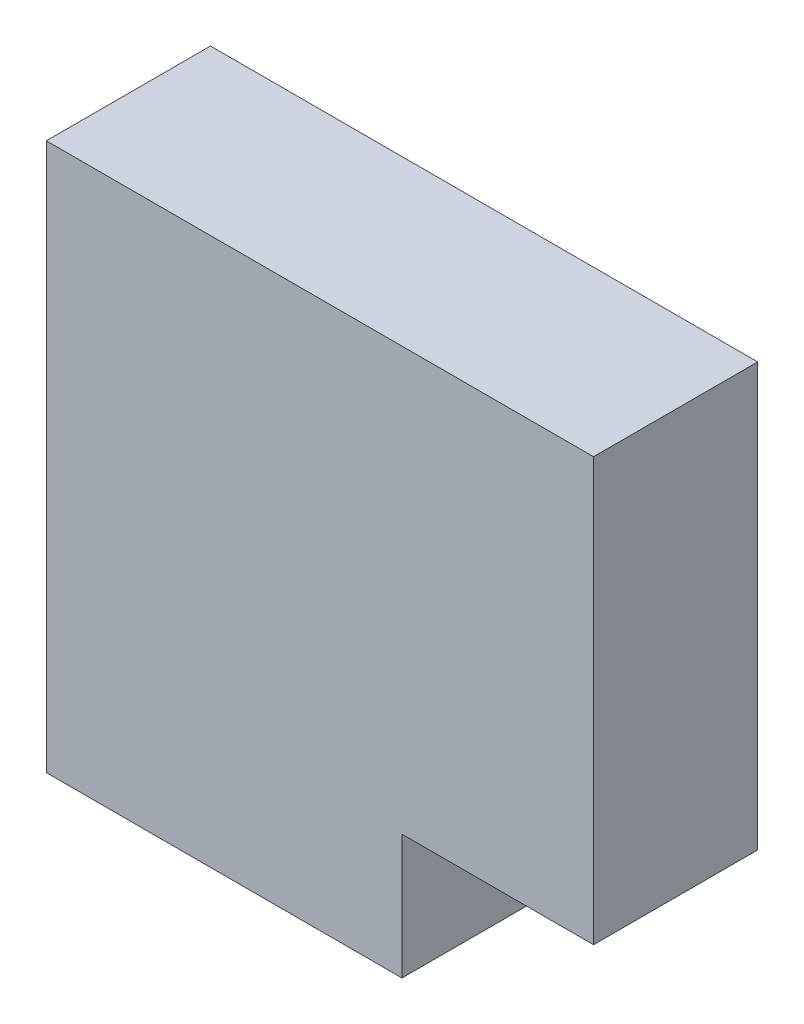
ISO-10303-21;
HEADER;
FILE_DESCRIPTION(('STEP AP214'),'2;1');
FILE_NAME('part.step','',(''),(''),'','','');
FILE_SCHEMA(('AUTOMOTIVE_DESIGN { 1 0 10303 214 1 1 1 1 }'));
ENDSEC;
DATA;
#1=APPLICATION_CONTEXT('core data for automotive mechanical design processes');
#2=APPLICATION_PROTOCOL_DEFINITION('international standard','automotive_design',2000,#1);
#3=PRODUCT_CONTEXT('',#1,'mechanical');
#4=PRODUCT('Part','Part','',(#3));
#5=PRODUCT_RELATED_PRODUCT_CATEGORY('part','',(#4));
#6=PRODUCT_DEFINITION_FORMATION('','',#4);
#7=PRODUCT_DEFINITION_CONTEXT('part definition',#1,'design');
#8=PRODUCT_DEFINITION('design','',#6,#7);
#9=PRODUCT_DEFINITION_SHAPE('','',#8);
#10=(LENGTH_UNIT() NAMED_UNIT(*) SI_UNIT(.MILLI.,.METRE.));
#11=(NAMED_UNIT(*) PLANE_ANGLE_UNIT() SI_UNIT($,.RADIAN.));
#12=(NAMED_UNIT(*) SI_UNIT($,.STERADIAN.) SOLID_ANGLE_UNIT());
#13=UNCERTAINTY_MEASURE_WITH_UNIT(LENGTH_MEASURE(1.E-05),#10,'distance_accuracy_value','');
#14=(GEOMETRIC_REPRESENTATION_CONTEXT(3) GLOBAL_UNCERTAINTY_ASSIGNED_CONTEXT((#13)) GLOBAL_UNIT_ASSIGNED_CONTEXT((#10,
#11,#12)) REPRESENTATION_CONTEXT('',''));
#15=CARTESIAN_POINT('',(0.,0.,0.));
#16=DIRECTION('',(0.,0.,1.));
#17=DIRECTION('',(1.,0.,0.));
#18=AXIS2_PLACEMENT_3D('',#15,#16,#17);
#19=CARTESIAN_POINT('',(-7.76124141762908,11.057268722467,6.));
#20=DIRECTION('',(1.,0.,0.));
#21=DIRECTION('',(0.,1.,0.));
#22=AXIS2_PLACEMENT_3D('',#19,#20,#21);
#23=PLANE('',#22);
#24=DIRECTION('',(0.,-1.,0.));
#25=VECTOR('',#24,1.);
#26=CARTESIAN_POINT('',(-7.76124141762908,11.057268722467,0.));
#27=LINE('',#26,#25);
#28=CARTESIAN_POINT('',(-7.76124141762908,11.057268722467,0.));
#29=VERTEX_POINT('',#28);
#30=CARTESIAN_POINT('',(-7.76124141762908,-8.94273127753303,0.));
#31=VERTEX_POINT('',#30);
#32=EDGE_CURVE('E112',#29,#31,#27,.T.);
#33=ORIENTED_EDGE('',*,*,#32,.T.);
#34=DIRECTION('',(0.,0.,-1.));
#35=VECTOR('',#34,1.);
#36=CARTESIAN_POINT('',(-7.76124141762908,-8.94273127753303,6.));
#37=LINE('',#36,#35);
#38=CARTESIAN_POINT('',(-7.76124141762908,-8.94273127753303,6.));
#39=VERTEX_POINT('',#38);
#40=EDGE_CURVE('E11',#39,#31,#37,.T.);
#41=ORIENTED_EDGE('',*,*,#40,.F.);
#42=DIRECTION('',(0.,-1.,0.));
#43=VECTOR('',#42,1.);
#44=CARTESIAN_POINT('',(-7.76124141762908,11.057268722467,6.));
#45=LINE('',#44,#43);
#46=CARTESIAN_POINT('',(-7.76124141762908,11.057268722467,6.));
#47=VERTEX_POINT('',#46);
#48=EDGE_CURVE('E120',#47,#39,#45,.T.);
#49=ORIENTED_EDGE('',*,*,#48,.F.);
#50=DIRECTION('',(0.,0.,-1.));
#51=VECTOR('',#50,1.);
#52=CARTESIAN_POINT('',(-7.76124141762908,11.057268722467,6.));
#53=LINE('',#52,#51);
#54=EDGE_CURVE('E121',#47,#29,#53,.T.);
#55=ORIENTED_EDGE('',*,*,#54,.T.);
#56=EDGE_LOOP('',(#33,#41,#49,#55));
#57=FACE_BOUND('',#56,.T.);
#58=ADVANCED_FACE('F33',(#57),#23,.F.);
#59=CARTESIAN_POINT('',(-7.76124141762908,-8.94273127753303,6.));
#60=DIRECTION('',(0.,1.,0.));
#61=DIRECTION('',(0.,0.,1.));
#62=AXIS2_PLACEMENT_3D('',#59,#60,#61);
#63=PLANE('',#62);
#64=DIRECTION('',(1.,0.,0.));
#65=VECTOR('',#64,1.);
#66=CARTESIAN_POINT('',(-7.76124141762908,-8.94273127753303,0.));
#67=LINE('',#66,#65);
#68=CARTESIAN_POINT('',(5.23875858237092,-8.94273127753303,0.));
#69=VERTEX_POINT('',#68);
#70=EDGE_CURVE('E104',#31,#69,#67,.T.);
#71=ORIENTED_EDGE('',*,*,#70,.T.);
#72=DIRECTION('',(0.,0.,1.));
#73=VECTOR('',#72,1.);
#74=CARTESIAN_POINT('',(5.23875858237092,-8.94273127753303,0.));
#75=LINE('',#74,#73);
#76=CARTESIAN_POINT('',(5.23875858237092,-8.94273127753303,6.));
#77=VERTEX_POINT('',#76);
#78=EDGE_CURVE('E92',#69,#77,#75,.T.);
#79=ORIENTED_EDGE('',*,*,#78,.T.);
#80=DIRECTION('',(1.,0.,0.));
#81=VECTOR('',#80,1.);
#82=CARTESIAN_POINT('',(-7.76124141762908,-8.94273127753303,6.));
#83=LINE('',#82,#81);
#84=EDGE_CURVE('E79',#39,#77,#83,.T.);
#85=ORIENTED_EDGE('',*,*,#84,.F.);
#86=ORIENTED_EDGE('',*,*,#40,.T.);
#87=EDGE_LOOP('',(#71,#79,#85,#86));
#88=FACE_BOUND('',#87,.T.);
#89=ADVANCED_FACE('F108',(#88),#63,.F.);
#90=CARTESIAN_POINT('',(12.2387585823709,11.057268722467,6.));
#91=DIRECTION('',(-1.,0.,0.));
#92=DIRECTION('',(0.,-1.,0.));
#93=AXIS2_PLACEMENT_3D('',#90,#91,#92);
#94=PLANE('',#93);
#95=DIRECTION('',(0.,1.,0.));
#96=VECTOR('',#95,1.);
#97=CARTESIAN_POINT('',(12.2387585823709,11.057268722467,6.));
#98=LINE('',#97,#96);
#99=CARTESIAN_POINT('',(12.2387585823709,-4.39046706234745,6.));
#100=VERTEX_POINT('',#99);
#101=CARTESIAN_POINT('',(12.2387585823709,11.057268722467,6.));
#102=VERTEX_POINT('',#101);
#103=EDGE_CURVE('E129',#100,#102,#98,.T.);
#104=ORIENTED_EDGE('',*,*,#103,.F.);
#105=DIRECTION('',(0.,0.,1.));
#106=VECTOR('',#105,1.);
#107=CARTESIAN_POINT('',(12.2387585823709,-4.39046706234745,0.));
#108=LINE('',#107,#106);
#109=CARTESIAN_POINT('',(12.2387585823709,-4.39046706234745,0.));
#110=VERTEX_POINT('',#109);
#111=EDGE_CURVE('E97',#110,#100,#108,.T.);
#112=ORIENTED_EDGE('',*,*,#111,.F.);
#113=DIRECTION('',(0.,1.,0.));
#114=VECTOR('',#113,1.);
#115=CARTESIAN_POINT('',(12.2387585823709,11.057268722467,0.));
#116=LINE('',#115,#114);
#117=CARTESIAN_POINT('',(12.2387585823709,11.057268722467,0.));
#118=VERTEX_POINT('',#117);
#119=EDGE_CURVE('E111',#110,#118,#116,.T.);
#120=ORIENTED_EDGE('',*,*,#119,.T.);
#121=DIRECTION('',(0.,0.,-1.));
#122=VECTOR('',#121,1.);
#123=CARTESIAN_POINT('',(12.2387585823709,11.057268722467,6.));
#124=LINE('',#123,#122);
#125=EDGE_CURVE('E40',#102,#118,#124,.T.);
#126=ORIENTED_EDGE('',*,*,#125,.F.);
#127=EDGE_LOOP('',(#104,#112,#120,#126));
#128=FACE_BOUND('',#127,.T.);
#129=ADVANCED_FACE('F137',(#128),#94,.F.);
#130=CARTESIAN_POINT('',(-7.76124141762908,11.057268722467,6.));
#131=DIRECTION('',(0.,-1.,0.));
#132=DIRECTION('',(0.,0.,-1.));
#133=AXIS2_PLACEMENT_3D('',#130,#131,#132);
#134=PLANE('',#133);
#135=DIRECTION('',(-1.,0.,0.));
#136=VECTOR('',#135,1.);
#137=CARTESIAN_POINT('',(-7.76124141762908,11.057268722467,0.));
#138=LINE('',#137,#136);
#139=EDGE_CURVE('E73',#118,#29,#138,.T.);
#140=ORIENTED_EDGE('',*,*,#139,.T.);
#141=ORIENTED_EDGE('',*,*,#54,.F.);
#142=DIRECTION('',(-1.,0.,0.));
#143=VECTOR('',#142,1.);
#144=CARTESIAN_POINT('',(-7.76124141762908,11.057268722467,6.));
#145=LINE('',#144,#143);
#146=EDGE_CURVE('E56',#102,#47,#145,.T.);
#147=ORIENTED_EDGE('',*,*,#146,.F.);
#148=ORIENTED_EDGE('',*,*,#125,.T.);
#149=EDGE_LOOP('',(#140,#141,#147,#148));
#150=FACE_BOUND('',#149,.T.);
#151=ADVANCED_FACE('F123',(#150),#134,.F.);
#152=CARTESIAN_POINT('',(0.,0.,6.));
#153=DIRECTION('',(0.,0.,1.));
#154=DIRECTION('',(1.,0.,0.));
#155=AXIS2_PLACEMENT_3D('',#152,#153,#154);
#156=PLANE('',#155);
#157=DIRECTION('',(0.,-1.,0.));
#158=VECTOR('',#157,1.);
#159=CARTESIAN_POINT('',(5.23875858237092,-4.39046706234745,6.));
#160=LINE('',#159,#158);
#161=CARTESIAN_POINT('',(5.23875858237092,-4.39046706234745,6.));
#162=VERTEX_POINT('',#161);
#163=EDGE_CURVE('E95',#162,#77,#160,.T.);
#164=ORIENTED_EDGE('',*,*,#163,.F.);
#165=DIRECTION('',(-1.,0.,0.));
#166=VECTOR('',#165,1.);
#167=CARTESIAN_POINT('',(5.23875858237092,-4.39046706234745,6.));
#168=LINE('',#167,#166);
#169=EDGE_CURVE('E106',#100,#162,#168,.T.);
#170=ORIENTED_EDGE('',*,*,#169,.F.);
#171=ORIENTED_EDGE('',*,*,#103,.T.);
#172=ORIENTED_EDGE('',*,*,#146,.T.);
#173=ORIENTED_EDGE('',*,*,#48,.T.);
#174=ORIENTED_EDGE('',*,*,#84,.T.);
#175=EDGE_LOOP('',(#164,#170,#171,#172,#173,#174));
#176=FACE_BOUND('',#175,.T.);
#177=ADVANCED_FACE('F134',(#176),#156,.T.);
#178=CARTESIAN_POINT('',(0.,0.,0.));
#179=DIRECTION('',(0.,0.,1.));
#180=DIRECTION('',(1.,0.,0.));
#181=AXIS2_PLACEMENT_3D('',#178,#179,#180);
#182=PLANE('',#181);
#183=DIRECTION('',(-1.,0.,0.));
#184=VECTOR('',#183,1.);
#185=CARTESIAN_POINT('',(5.23875858237092,-4.39046706234745,0.));
#186=LINE('',#185,#184);
#187=CARTESIAN_POINT('',(5.23875858237092,-4.39046706234745,0.));
#188=VERTEX_POINT('',#187);
#189=EDGE_CURVE('E98',#110,#188,#186,.T.);
#190=ORIENTED_EDGE('',*,*,#189,.T.);
#191=DIRECTION('',(0.,-1.,0.));
#192=VECTOR('',#191,1.);
#193=CARTESIAN_POINT('',(5.23875858237092,-4.39046706234745,0.));
#194=LINE('',#193,#192);
#195=EDGE_CURVE('E47',#188,#69,#194,.T.);
#196=ORIENTED_EDGE('',*,*,#195,.T.);
#197=ORIENTED_EDGE('',*,*,#70,.F.);
#198=ORIENTED_EDGE('',*,*,#32,.F.);
#199=ORIENTED_EDGE('',*,*,#139,.F.);
#200=ORIENTED_EDGE('',*,*,#119,.F.);
#201=EDGE_LOOP('',(#190,#196,#197,#198,#199,#200));
#202=FACE_BOUND('',#201,.T.);
#203=ADVANCED_FACE('F102',(#202),#182,.F.);
#204=CARTESIAN_POINT('',(5.23875858237092,-4.39046706234745,0.));
#205=DIRECTION('',(-1.,0.,0.));
#206=DIRECTION('',(0.,0.,1.));
#207=AXIS2_PLACEMENT_3D('',#204,#205,#206);
#208=PLANE('',#207);
#209=ORIENTED_EDGE('',*,*,#163,.T.);
#210=ORIENTED_EDGE('',*,*,#78,.F.);
#211=ORIENTED_EDGE('',*,*,#195,.F.);
#212=DIRECTION('',(0.,0.,1.));
#213=VECTOR('',#212,1.);
#214=CARTESIAN_POINT('',(5.23875858237092,-4.39046706234745,0.));
#215=LINE('',#214,#213);
#216=EDGE_CURVE('E115',#188,#162,#215,.T.);
#217=ORIENTED_EDGE('',*,*,#216,.T.);
#218=EDGE_LOOP('',(#209,#210,#211,#217));
#219=FACE_BOUND('',#218,.T.);
#220=ADVANCED_FACE('F93',(#219),#208,.F.);
#221=CARTESIAN_POINT('',(5.23875858237092,-4.39046706234745,0.));
#222=DIRECTION('',(0.,1.,0.));
#223=DIRECTION('',(-1.,0.,0.));
#224=AXIS2_PLACEMENT_3D('',#221,#222,#223);
#225=PLANE('',#224);
#226=ORIENTED_EDGE('',*,*,#169,.T.);
#227=ORIENTED_EDGE('',*,*,#216,.F.);
#228=ORIENTED_EDGE('',*,*,#189,.F.);
#229=ORIENTED_EDGE('',*,*,#111,.T.);
#230=EDGE_LOOP('',(#226,#227,#228,#229));
#231=FACE_BOUND('',#230,.T.);
#232=ADVANCED_FACE('F143',(#231),#225,.F.);
#233=CLOSED_SHELL('',(#58,#89,#129,#151,#177,#203,#220,#232));
#234=MANIFOLD_SOLID_BREP('B2',#233);
#235=ADVANCED_BREP_SHAPE_REPRESENTATION('',(#18,#234),#14);
#236=SHAPE_DEFINITION_REPRESENTATION(#9,#235);
ENDSEC;
END-ISO-10303-21;
